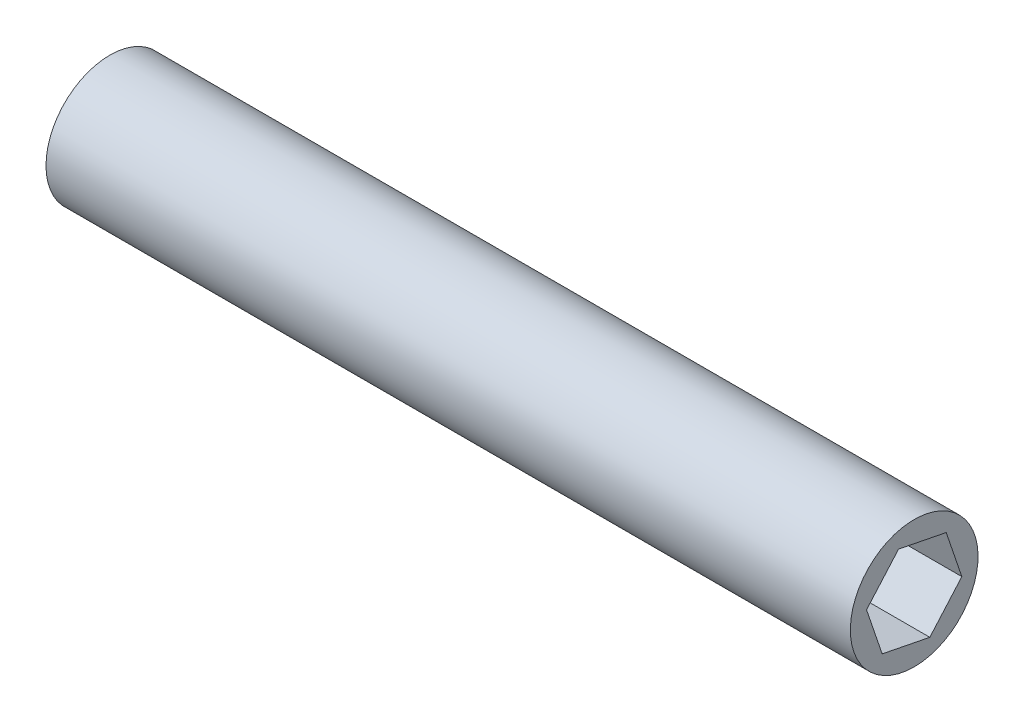
ISO-10303-21;
HEADER;
FILE_DESCRIPTION(('STEP AP214'),'2;1');
FILE_NAME('part.step','',(''),(''),'','','');
FILE_SCHEMA(('AUTOMOTIVE_DESIGN { 1 0 10303 214 1 1 1 1 }'));
ENDSEC;
DATA;
#1=APPLICATION_CONTEXT('core data for automotive mechanical design processes');
#2=APPLICATION_PROTOCOL_DEFINITION('international standard','automotive_design',2000,#1);
#3=PRODUCT_CONTEXT('',#1,'mechanical');
#4=PRODUCT('Part','Part','',(#3));
#5=PRODUCT_RELATED_PRODUCT_CATEGORY('part','',(#4));
#6=PRODUCT_DEFINITION_FORMATION('','',#4);
#7=PRODUCT_DEFINITION_CONTEXT('part definition',#1,'design');
#8=PRODUCT_DEFINITION('design','',#6,#7);
#9=PRODUCT_DEFINITION_SHAPE('','',#8);
#10=(LENGTH_UNIT() NAMED_UNIT(*) SI_UNIT(.MILLI.,.METRE.));
#11=(NAMED_UNIT(*) PLANE_ANGLE_UNIT() SI_UNIT($,.RADIAN.));
#12=(NAMED_UNIT(*) SI_UNIT($,.STERADIAN.) SOLID_ANGLE_UNIT());
#13=UNCERTAINTY_MEASURE_WITH_UNIT(LENGTH_MEASURE(1.E-05),#10,'distance_accuracy_value','');
#14=(GEOMETRIC_REPRESENTATION_CONTEXT(3) GLOBAL_UNCERTAINTY_ASSIGNED_CONTEXT((#13)) GLOBAL_UNIT_ASSIGNED_CONTEXT((#10,
#11,#12)) REPRESENTATION_CONTEXT('',''));
#15=CARTESIAN_POINT('',(0.,0.,0.));
#16=DIRECTION('',(0.,0.,1.));
#17=DIRECTION('',(1.,0.,0.));
#18=AXIS2_PLACEMENT_3D('',#15,#16,#17);
#19=CARTESIAN_POINT('',(193.3575,181.652155656906,-160.333488395778));
#20=DIRECTION('',(1.,0.,0.));
#21=DIRECTION('',(0.,1.,0.));
#22=AXIS2_PLACEMENT_3D('',#19,#20,#21);
#23=PLANE('',#22);
#24=CARTESIAN_POINT('',(193.3575,181.652155656906,-160.333488395778));
#25=DIRECTION('',(1.,0.,0.));
#26=DIRECTION('',(0.,1.,0.));
#27=AXIS2_PLACEMENT_3D('',#24,#25,#26);
#28=CIRCLE('',#27,9.65199999999999);
#29=CARTESIAN_POINT('',(193.3575,191.304155656906,-160.333488395778));
#30=VERTEX_POINT('',#29);
#31=EDGE_CURVE('E93',#30,#30,#28,.T.);
#32=ORIENTED_EDGE('',*,*,#31,.F.);
#33=EDGE_LOOP('',(#32));
#34=FACE_BOUND('',#33,.T.);
#35=DIRECTION('',(0.,-0.946858300457369,-0.321650989202557));
#36=VECTOR('',#35,1.);
#37=CARTESIAN_POINT('',(193.3575,183.083269535574,-153.13038399099));
#38=LINE('',#37,#36);
#39=CARTESIAN_POINT('',(193.3575,183.083269535574,-153.13038399099));
#40=VERTEX_POINT('',#39);
#41=CARTESIAN_POINT('',(193.3575,176.129641195581,-155.492555218749));
#42=VERTEX_POINT('',#41);
#43=EDGE_CURVE('E90',#40,#42,#38,.T.);
#44=ORIENTED_EDGE('',*,*,#43,.T.);
#45=DIRECTION('',(0.,-0.194871222426876,-0.980828836581518));
#46=VECTOR('',#45,1.);
#47=CARTESIAN_POINT('',(193.3575,176.129641195581,-155.492555218749));
#48=LINE('',#47,#46);
#49=CARTESIAN_POINT('',(193.3575,174.698527316913,-162.695659623538));
#50=VERTEX_POINT('',#49);
#51=EDGE_CURVE('E96',#42,#50,#48,.T.);
#52=ORIENTED_EDGE('',*,*,#51,.T.);
#53=DIRECTION('',(0.,0.751987078030494,-0.659177847378961));
#54=VECTOR('',#53,1.);
#55=CARTESIAN_POINT('',(193.3575,174.698527316913,-162.695659623538));
#56=LINE('',#55,#54);
#57=CARTESIAN_POINT('',(193.3575,180.221041778238,-167.536592800567));
#58=VERTEX_POINT('',#57);
#59=EDGE_CURVE('E100',#50,#58,#56,.T.);
#60=ORIENTED_EDGE('',*,*,#59,.T.);
#61=DIRECTION('',(0.,0.946858300457369,0.321650989202557));
#62=VECTOR('',#61,1.);
#63=CARTESIAN_POINT('',(193.3575,180.221041778238,-167.536592800567));
#64=LINE('',#63,#62);
#65=CARTESIAN_POINT('',(193.3575,187.17467011823,-165.174421572808));
#66=VERTEX_POINT('',#65);
#67=EDGE_CURVE('E140',#58,#66,#64,.T.);
#68=ORIENTED_EDGE('',*,*,#67,.T.);
#69=DIRECTION('',(0.,0.194871222426876,0.980828836581518));
#70=VECTOR('',#69,1.);
#71=CARTESIAN_POINT('',(193.3575,187.17467011823,-165.174421572808));
#72=LINE('',#71,#70);
#73=CARTESIAN_POINT('',(193.3575,188.605783996898,-157.971317168019));
#74=VERTEX_POINT('',#73);
#75=EDGE_CURVE('E138',#66,#74,#72,.T.);
#76=ORIENTED_EDGE('',*,*,#75,.T.);
#77=DIRECTION('',(0.,-0.751987078030494,0.659177847378961));
#78=VECTOR('',#77,1.);
#79=CARTESIAN_POINT('',(193.3575,188.605783996898,-157.971317168019));
#80=LINE('',#79,#78);
#81=EDGE_CURVE('E104',#74,#40,#80,.T.);
#82=ORIENTED_EDGE('',*,*,#81,.T.);
#83=EDGE_LOOP('',(#44,#52,#60,#68,#76,#82));
#84=FACE_BOUND('',#83,.T.);
#85=ADVANCED_FACE('F32',(#34,#84),#23,.F.);
#86=CARTESIAN_POINT('',(342.259978608051,181.652155656906,-160.333488395778));
#87=DIRECTION('',(-1.,0.,0.));
#88=DIRECTION('',(0.,-1.,0.));
#89=AXIS2_PLACEMENT_3D('',#86,#87,#88);
#90=CYLINDRICAL_SURFACE('',#89,9.65199999999999);
#91=CARTESIAN_POINT('',(314.96,181.652155656906,-160.333488395778));
#92=DIRECTION('',(-1.,0.,0.));
#93=DIRECTION('',(0.,-1.,0.));
#94=AXIS2_PLACEMENT_3D('',#91,#92,#93);
#95=CIRCLE('',#94,9.65199999999999);
#96=CARTESIAN_POINT('',(314.96,172.000155656906,-160.333488395778));
#97=VERTEX_POINT('',#96);
#98=EDGE_CURVE('E108',#97,#97,#95,.T.);
#99=ORIENTED_EDGE('',*,*,#98,.T.);
#100=EDGE_LOOP('',(#99));
#101=FACE_BOUND('',#100,.T.);
#102=ORIENTED_EDGE('',*,*,#31,.T.);
#103=EDGE_LOOP('',(#102));
#104=FACE_BOUND('',#103,.T.);
#105=ADVANCED_FACE('F148',(#101,#104),#90,.T.);
#106=CARTESIAN_POINT('',(342.259978608051,183.083269535574,-153.13038399099));
#107=DIRECTION('',(0.,0.321650989202557,-0.946858300457369));
#108=DIRECTION('',(0.,0.946858300457369,0.321650989202557));
#109=AXIS2_PLACEMENT_3D('',#106,#107,#108);
#110=PLANE('',#109);
#111=DIRECTION('',(0.,0.946858300457369,0.321650989202557));
#112=VECTOR('',#111,1.);
#113=CARTESIAN_POINT('',(314.96,183.083269535574,-153.13038399099));
#114=LINE('',#113,#112);
#115=CARTESIAN_POINT('',(314.96,176.129641195581,-155.492555218749));
#116=VERTEX_POINT('',#115);
#117=CARTESIAN_POINT('',(314.96,183.083269535574,-153.13038399099));
#118=VERTEX_POINT('',#117);
#119=EDGE_CURVE('E92',#116,#118,#114,.T.);
#120=ORIENTED_EDGE('',*,*,#119,.F.);
#121=DIRECTION('',(-1.,0.,0.));
#122=VECTOR('',#121,1.);
#123=CARTESIAN_POINT('',(342.259978608051,176.129641195581,-155.492555218749));
#124=LINE('',#123,#122);
#125=EDGE_CURVE('E86',#116,#42,#124,.T.);
#126=ORIENTED_EDGE('',*,*,#125,.T.);
#127=ORIENTED_EDGE('',*,*,#43,.F.);
#128=DIRECTION('',(-1.,0.,0.));
#129=VECTOR('',#128,1.);
#130=CARTESIAN_POINT('',(342.259978608051,183.083269535574,-153.13038399099));
#131=LINE('',#130,#129);
#132=EDGE_CURVE('E120',#118,#40,#131,.T.);
#133=ORIENTED_EDGE('',*,*,#132,.F.);
#134=EDGE_LOOP('',(#120,#126,#127,#133));
#135=FACE_BOUND('',#134,.T.);
#136=ADVANCED_FACE('F87',(#135),#110,.T.);
#137=CARTESIAN_POINT('',(342.259978608051,176.129641195581,-155.492555218749));
#138=DIRECTION('',(0.,0.980828836581518,-0.194871222426876));
#139=DIRECTION('',(0.,0.194871222426876,0.980828836581519));
#140=AXIS2_PLACEMENT_3D('',#137,#138,#139);
#141=PLANE('',#140);
#142=DIRECTION('',(0.,0.194871222426876,0.980828836581519));
#143=VECTOR('',#142,1.);
#144=CARTESIAN_POINT('',(314.96,176.129641195581,-155.492555218749));
#145=LINE('',#144,#143);
#146=CARTESIAN_POINT('',(314.96,174.698527316913,-162.695659623538));
#147=VERTEX_POINT('',#146);
#148=EDGE_CURVE('E11',#147,#116,#145,.T.);
#149=ORIENTED_EDGE('',*,*,#148,.F.);
#150=DIRECTION('',(-1.,0.,0.));
#151=VECTOR('',#150,1.);
#152=CARTESIAN_POINT('',(342.259978608051,174.698527316913,-162.695659623538));
#153=LINE('',#152,#151);
#154=EDGE_CURVE('E80',#147,#50,#153,.T.);
#155=ORIENTED_EDGE('',*,*,#154,.T.);
#156=ORIENTED_EDGE('',*,*,#51,.F.);
#157=ORIENTED_EDGE('',*,*,#125,.F.);
#158=EDGE_LOOP('',(#149,#155,#156,#157));
#159=FACE_BOUND('',#158,.T.);
#160=ADVANCED_FACE('F97',(#159),#141,.T.);
#161=CARTESIAN_POINT('',(342.259978608051,174.698527316913,-162.695659623538));
#162=DIRECTION('',(0.,0.659177847378961,0.751987078030494));
#163=DIRECTION('',(0.,-0.751987078030494,0.659177847378961));
#164=AXIS2_PLACEMENT_3D('',#161,#162,#163);
#165=PLANE('',#164);
#166=DIRECTION('',(0.,-0.751987078030494,0.659177847378961));
#167=VECTOR('',#166,1.);
#168=CARTESIAN_POINT('',(314.96,174.698527316913,-162.695659623538));
#169=LINE('',#168,#167);
#170=CARTESIAN_POINT('',(314.96,180.221041778238,-167.536592800567));
#171=VERTEX_POINT('',#170);
#172=EDGE_CURVE('E42',#171,#147,#169,.T.);
#173=ORIENTED_EDGE('',*,*,#172,.F.);
#174=DIRECTION('',(-1.,0.,0.));
#175=VECTOR('',#174,1.);
#176=CARTESIAN_POINT('',(342.259978608051,180.221041778238,-167.536592800567));
#177=LINE('',#176,#175);
#178=EDGE_CURVE('E114',#171,#58,#177,.T.);
#179=ORIENTED_EDGE('',*,*,#178,.T.);
#180=ORIENTED_EDGE('',*,*,#59,.F.);
#181=ORIENTED_EDGE('',*,*,#154,.F.);
#182=EDGE_LOOP('',(#173,#179,#180,#181));
#183=FACE_BOUND('',#182,.T.);
#184=ADVANCED_FACE('F166',(#183),#165,.T.);
#185=CARTESIAN_POINT('',(342.259978608051,180.221041778238,-167.536592800567));
#186=DIRECTION('',(0.,-0.321650989202557,0.946858300457369));
#187=DIRECTION('',(0.,-0.946858300457369,-0.321650989202557));
#188=AXIS2_PLACEMENT_3D('',#185,#186,#187);
#189=PLANE('',#188);
#190=DIRECTION('',(0.,-0.946858300457369,-0.321650989202557));
#191=VECTOR('',#190,1.);
#192=CARTESIAN_POINT('',(314.96,180.221041778238,-167.536592800567));
#193=LINE('',#192,#191);
#194=CARTESIAN_POINT('',(314.96,187.17467011823,-165.174421572808));
#195=VERTEX_POINT('',#194);
#196=EDGE_CURVE('E123',#195,#171,#193,.T.);
#197=ORIENTED_EDGE('',*,*,#196,.F.);
#198=DIRECTION('',(-1.,0.,0.));
#199=VECTOR('',#198,1.);
#200=CARTESIAN_POINT('',(342.259978608051,187.17467011823,-165.174421572808));
#201=LINE('',#200,#199);
#202=EDGE_CURVE('E116',#195,#66,#201,.T.);
#203=ORIENTED_EDGE('',*,*,#202,.T.);
#204=ORIENTED_EDGE('',*,*,#67,.F.);
#205=ORIENTED_EDGE('',*,*,#178,.F.);
#206=EDGE_LOOP('',(#197,#203,#204,#205));
#207=FACE_BOUND('',#206,.T.);
#208=ADVANCED_FACE('F134',(#207),#189,.T.);
#209=CARTESIAN_POINT('',(342.259978608051,187.17467011823,-165.174421572808));
#210=DIRECTION('',(0.,-0.980828836581518,0.194871222426876));
#211=DIRECTION('',(0.,-0.194871222426876,-0.980828836581519));
#212=AXIS2_PLACEMENT_3D('',#209,#210,#211);
#213=PLANE('',#212);
#214=DIRECTION('',(0.,-0.194871222426876,-0.980828836581519));
#215=VECTOR('',#214,1.);
#216=CARTESIAN_POINT('',(314.96,187.17467011823,-165.174421572808));
#217=LINE('',#216,#215);
#218=CARTESIAN_POINT('',(314.96,188.605783996898,-157.971317168019));
#219=VERTEX_POINT('',#218);
#220=EDGE_CURVE('E36',#219,#195,#217,.T.);
#221=ORIENTED_EDGE('',*,*,#220,.F.);
#222=DIRECTION('',(-1.,0.,0.));
#223=VECTOR('',#222,1.);
#224=CARTESIAN_POINT('',(342.259978608051,188.605783996898,-157.971317168019));
#225=LINE('',#224,#223);
#226=EDGE_CURVE('E118',#219,#74,#225,.T.);
#227=ORIENTED_EDGE('',*,*,#226,.T.);
#228=ORIENTED_EDGE('',*,*,#75,.F.);
#229=ORIENTED_EDGE('',*,*,#202,.F.);
#230=EDGE_LOOP('',(#221,#227,#228,#229));
#231=FACE_BOUND('',#230,.T.);
#232=ADVANCED_FACE('F137',(#231),#213,.T.);
#233=CARTESIAN_POINT('',(342.259978608051,188.605783996898,-157.971317168019));
#234=DIRECTION('',(0.,-0.659177847378961,-0.751987078030494));
#235=DIRECTION('',(0.,0.751987078030494,-0.659177847378961));
#236=AXIS2_PLACEMENT_3D('',#233,#234,#235);
#237=PLANE('',#236);
#238=DIRECTION('',(0.,0.751987078030494,-0.659177847378961));
#239=VECTOR('',#238,1.);
#240=CARTESIAN_POINT('',(314.96,188.605783996898,-157.971317168019));
#241=LINE('',#240,#239);
#242=EDGE_CURVE('E111',#118,#219,#241,.T.);
#243=ORIENTED_EDGE('',*,*,#242,.F.);
#244=ORIENTED_EDGE('',*,*,#132,.T.);
#245=ORIENTED_EDGE('',*,*,#81,.F.);
#246=ORIENTED_EDGE('',*,*,#226,.F.);
#247=EDGE_LOOP('',(#243,#244,#245,#246));
#248=FACE_BOUND('',#247,.T.);
#249=ADVANCED_FACE('F158',(#248),#237,.T.);
#250=CARTESIAN_POINT('',(314.96,188.712360620908,-153.752104812802));
#251=DIRECTION('',(-1.,0.,0.));
#252=DIRECTION('',(0.,-0.681867341792056,0.731475856195839));
#253=AXIS2_PLACEMENT_3D('',#250,#251,#252);
#254=PLANE('',#253);
#255=ORIENTED_EDGE('',*,*,#119,.T.);
#256=ORIENTED_EDGE('',*,*,#242,.T.);
#257=ORIENTED_EDGE('',*,*,#220,.T.);
#258=ORIENTED_EDGE('',*,*,#196,.T.);
#259=ORIENTED_EDGE('',*,*,#172,.T.);
#260=ORIENTED_EDGE('',*,*,#148,.T.);
#261=EDGE_LOOP('',(#255,#256,#257,#258,#259,#260));
#262=FACE_BOUND('',#261,.T.);
#263=ORIENTED_EDGE('',*,*,#98,.F.);
#264=EDGE_LOOP('',(#263));
#265=FACE_BOUND('',#264,.T.);
#266=ADVANCED_FACE('F34',(#262,#265),#254,.F.);
#267=CLOSED_SHELL('',(#85,#105,#136,#160,#184,#208,#232,#249,#266));
#268=MANIFOLD_SOLID_BREP('B2',#267);
#269=ADVANCED_BREP_SHAPE_REPRESENTATION('',(#18,#268),#14);
#270=SHAPE_DEFINITION_REPRESENTATION(#9,#269);
ENDSEC;
END-ISO-10303-21;
